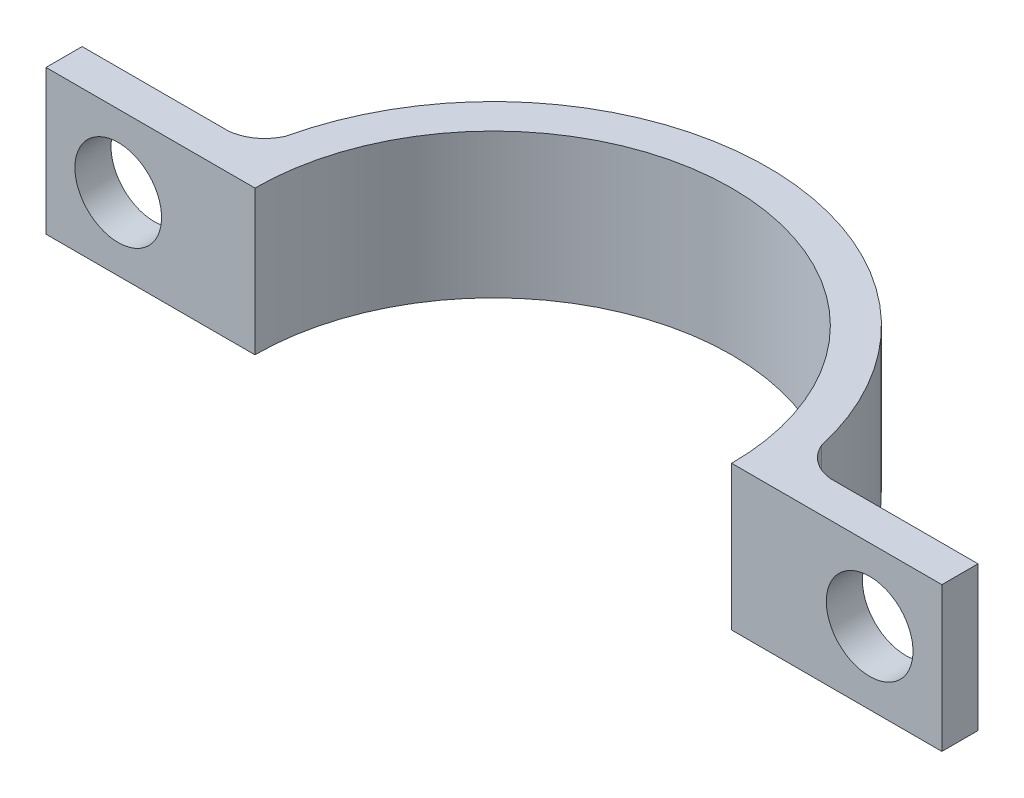
ISO-10303-21;
HEADER;
FILE_DESCRIPTION(('STEP AP214'),'2;1');
FILE_NAME('part.step','',(''),(''),'','','');
FILE_SCHEMA(('AUTOMOTIVE_DESIGN { 1 0 10303 214 1 1 1 1 }'));
ENDSEC;
DATA;
#1=APPLICATION_CONTEXT('core data for automotive mechanical design processes');
#2=APPLICATION_PROTOCOL_DEFINITION('international standard','automotive_design',2000,#1);
#3=PRODUCT_CONTEXT('',#1,'mechanical');
#4=PRODUCT('Part','Part','',(#3));
#5=PRODUCT_RELATED_PRODUCT_CATEGORY('part','',(#4));
#6=PRODUCT_DEFINITION_FORMATION('','',#4);
#7=PRODUCT_DEFINITION_CONTEXT('part definition',#1,'design');
#8=PRODUCT_DEFINITION('design','',#6,#7);
#9=PRODUCT_DEFINITION_SHAPE('','',#8);
#10=(LENGTH_UNIT() NAMED_UNIT(*) SI_UNIT(.MILLI.,.METRE.));
#11=(NAMED_UNIT(*) PLANE_ANGLE_UNIT() SI_UNIT($,.RADIAN.));
#12=(NAMED_UNIT(*) SI_UNIT($,.STERADIAN.) SOLID_ANGLE_UNIT());
#13=UNCERTAINTY_MEASURE_WITH_UNIT(LENGTH_MEASURE(1.E-05),#10,'distance_accuracy_value','');
#14=(GEOMETRIC_REPRESENTATION_CONTEXT(3) GLOBAL_UNCERTAINTY_ASSIGNED_CONTEXT((#13)) GLOBAL_UNIT_ASSIGNED_CONTEXT((#10,
#11,#12)) REPRESENTATION_CONTEXT('',''));
#15=CARTESIAN_POINT('',(0.,0.,0.));
#16=DIRECTION('',(0.,0.,1.));
#17=DIRECTION('',(1.,0.,0.));
#18=AXIS2_PLACEMENT_3D('',#15,#16,#17);
#19=CARTESIAN_POINT('',(22.902925638261,10.,4.77298113684332));
#20=DIRECTION('',(0.,-1.,0.));
#21=DIRECTION('',(0.,0.,-1.));
#22=AXIS2_PLACEMENT_3D('',#19,#20,#21);
#23=CYLINDRICAL_SURFACE('',#22,2.79217939644481);
#24=CARTESIAN_POINT('',(22.902925638261,0.,4.77298113684332));
#25=DIRECTION('',(0.,-1.,0.));
#26=DIRECTION('',(0.,0.,-1.));
#27=AXIS2_PLACEMENT_3D('',#24,#25,#26);
#28=CIRCLE('',#27,2.79217939644481);
#29=CARTESIAN_POINT('',(22.6391724501942,0.,7.5526753714158));
#30=VERTEX_POINT('',#29);
#31=CARTESIAN_POINT('',(20.3264501634081,0.,5.84910376434103));
#32=VERTEX_POINT('',#31);
#33=EDGE_CURVE('E144',#30,#32,#28,.T.);
#34=ORIENTED_EDGE('',*,*,#33,.T.);
#35=DIRECTION('',(0.,-1.,0.));
#36=VECTOR('',#35,1.);
#37=CARTESIAN_POINT('',(20.3264501634081,10.,5.84910376434103));
#38=LINE('',#37,#36);
#39=CARTESIAN_POINT('',(20.3264501634081,10.,5.84910376434103));
#40=VERTEX_POINT('',#39);
#41=EDGE_CURVE('E11',#40,#32,#38,.T.);
#42=ORIENTED_EDGE('',*,*,#41,.F.);
#43=CARTESIAN_POINT('',(22.902925638261,10.,4.77298113684332));
#44=DIRECTION('',(0.,-1.,0.));
#45=DIRECTION('',(0.,0.,-1.));
#46=AXIS2_PLACEMENT_3D('',#43,#44,#45);
#47=CIRCLE('',#46,2.79217939644481);
#48=CARTESIAN_POINT('',(22.6391724501942,10.,7.5526753714158));
#49=VERTEX_POINT('',#48);
#50=EDGE_CURVE('E162',#49,#40,#47,.T.);
#51=ORIENTED_EDGE('',*,*,#50,.F.);
#52=DIRECTION('',(0.,-1.,0.));
#53=VECTOR('',#52,1.);
#54=CARTESIAN_POINT('',(22.6391724501942,10.,7.5526753714158));
#55=LINE('',#54,#53);
#56=EDGE_CURVE('E140',#49,#30,#55,.T.);
#57=ORIENTED_EDGE('',*,*,#56,.T.);
#58=EDGE_LOOP('',(#34,#42,#51,#57));
#59=FACE_BOUND('',#58,.T.);
#60=ADVANCED_FACE('F35',(#59),#23,.F.);
#61=CARTESIAN_POINT('',(1.79728434990767,10.,10.0526753714158));
#62=DIRECTION('',(0.,-1.,0.));
#63=DIRECTION('',(0.,0.,-1.));
#64=AXIS2_PLACEMENT_3D('',#61,#62,#63);
#65=CYLINDRICAL_SURFACE('',#64,19.);
#66=CARTESIAN_POINT('',(1.79728434990767,0.,10.0526753714158));
#67=DIRECTION('',(0.,1.,0.));
#68=DIRECTION('',(0.,0.,1.));
#69=AXIS2_PLACEMENT_3D('',#66,#67,#68);
#70=CIRCLE('',#69,19.);
#71=CARTESIAN_POINT('',(-16.7318814635928,0.,5.849103764341));
#72=VERTEX_POINT('',#71);
#73=EDGE_CURVE('E147',#32,#72,#70,.T.);
#74=ORIENTED_EDGE('',*,*,#73,.T.);
#75=DIRECTION('',(0.,-1.,0.));
#76=VECTOR('',#75,1.);
#77=CARTESIAN_POINT('',(-16.7318814635928,10.,5.849103764341));
#78=LINE('',#77,#76);
#79=CARTESIAN_POINT('',(-16.7318814635928,10.,5.849103764341));
#80=VERTEX_POINT('',#79);
#81=EDGE_CURVE('E44',#80,#72,#78,.T.);
#82=ORIENTED_EDGE('',*,*,#81,.F.);
#83=CARTESIAN_POINT('',(1.79728434990767,10.,10.0526753714158));
#84=DIRECTION('',(0.,1.,0.));
#85=DIRECTION('',(0.,0.,1.));
#86=AXIS2_PLACEMENT_3D('',#83,#84,#85);
#87=CIRCLE('',#86,19.);
#88=EDGE_CURVE('E101',#40,#80,#87,.T.);
#89=ORIENTED_EDGE('',*,*,#88,.F.);
#90=ORIENTED_EDGE('',*,*,#41,.T.);
#91=EDGE_LOOP('',(#74,#82,#89,#90));
#92=FACE_BOUND('',#91,.T.);
#93=ADVANCED_FACE('F231',(#92),#65,.T.);
#94=CARTESIAN_POINT('',(-19.3083569384457,10.,4.77298113684332));
#95=DIRECTION('',(0.,-1.,0.));
#96=DIRECTION('',(0.,0.,-1.));
#97=AXIS2_PLACEMENT_3D('',#94,#95,#96);
#98=CYLINDRICAL_SURFACE('',#97,2.7921793964448);
#99=CARTESIAN_POINT('',(-19.3083569384457,0.,4.77298113684332));
#100=DIRECTION('',(0.,-1.,0.));
#101=DIRECTION('',(0.,0.,1.));
#102=AXIS2_PLACEMENT_3D('',#99,#100,#101);
#103=CIRCLE('',#102,2.7921793964448);
#104=CARTESIAN_POINT('',(-19.0446037503788,0.,7.55267537141579));
#105=VERTEX_POINT('',#104);
#106=EDGE_CURVE('E149',#72,#105,#103,.T.);
#107=ORIENTED_EDGE('',*,*,#106,.T.);
#108=DIRECTION('',(0.,-1.,0.));
#109=VECTOR('',#108,1.);
#110=CARTESIAN_POINT('',(-19.0446037503788,10.,7.55267537141579));
#111=LINE('',#110,#109);
#112=CARTESIAN_POINT('',(-19.0446037503788,10.,7.55267537141579));
#113=VERTEX_POINT('',#112);
#114=EDGE_CURVE('E175',#113,#105,#111,.T.);
#115=ORIENTED_EDGE('',*,*,#114,.F.);
#116=CARTESIAN_POINT('',(-19.3083569384457,10.,4.77298113684332));
#117=DIRECTION('',(0.,-1.,0.));
#118=DIRECTION('',(0.,0.,1.));
#119=AXIS2_PLACEMENT_3D('',#116,#117,#118);
#120=CIRCLE('',#119,2.7921793964448);
#121=EDGE_CURVE('E184',#80,#113,#120,.T.);
#122=ORIENTED_EDGE('',*,*,#121,.F.);
#123=ORIENTED_EDGE('',*,*,#81,.T.);
#124=EDGE_LOOP('',(#107,#115,#122,#123));
#125=FACE_BOUND('',#124,.T.);
#126=ADVANCED_FACE('F182',(#125),#98,.F.);
#127=CARTESIAN_POINT('',(-19.0446037503788,10.,7.5526753714158));
#128=DIRECTION('',(0.,0.,1.));
#129=DIRECTION('',(1.,0.,0.));
#130=AXIS2_PLACEMENT_3D('',#127,#128,#129);
#131=PLANE('',#130);
#132=CARTESIAN_POINT('',(-24.1654442066561,5.,7.5526753714158));
#133=DIRECTION('',(0.,0.,-1.));
#134=DIRECTION('',(-1.,0.,0.));
#135=AXIS2_PLACEMENT_3D('',#132,#133,#134);
#136=CIRCLE('',#135,3.);
#137=CARTESIAN_POINT('',(-27.1654442066561,5.,7.5526753714158));
#138=VERTEX_POINT('',#137);
#139=EDGE_CURVE('E213',#138,#138,#136,.T.);
#140=ORIENTED_EDGE('',*,*,#139,.F.);
#141=EDGE_LOOP('',(#140));
#142=FACE_BOUND('',#141,.T.);
#143=DIRECTION('',(-1.,0.,0.));
#144=VECTOR('',#143,1.);
#145=CARTESIAN_POINT('',(-19.0446037503788,0.,7.5526753714158));
#146=LINE('',#145,#144);
#147=CARTESIAN_POINT('',(-29.1654442066561,0.,7.5526753714158));
#148=VERTEX_POINT('',#147);
#149=EDGE_CURVE('E151',#105,#148,#146,.T.);
#150=ORIENTED_EDGE('',*,*,#149,.T.);
#151=DIRECTION('',(0.,-1.,0.));
#152=VECTOR('',#151,1.);
#153=CARTESIAN_POINT('',(-29.1654442066561,10.,7.5526753714158));
#154=LINE('',#153,#152);
#155=CARTESIAN_POINT('',(-29.1654442066561,10.,7.5526753714158));
#156=VERTEX_POINT('',#155);
#157=EDGE_CURVE('E172',#156,#148,#154,.T.);
#158=ORIENTED_EDGE('',*,*,#157,.F.);
#159=DIRECTION('',(-1.,0.,0.));
#160=VECTOR('',#159,1.);
#161=CARTESIAN_POINT('',(-19.0446037503788,10.,7.5526753714158));
#162=LINE('',#161,#160);
#163=EDGE_CURVE('E202',#113,#156,#162,.T.);
#164=ORIENTED_EDGE('',*,*,#163,.F.);
#165=ORIENTED_EDGE('',*,*,#114,.T.);
#166=EDGE_LOOP('',(#150,#158,#164,#165));
#167=FACE_BOUND('',#166,.T.);
#168=ADVANCED_FACE('F193',(#142,#167),#131,.F.);
#169=CARTESIAN_POINT('',(-29.1654442066561,10.,7.5526753714158));
#170=DIRECTION('',(1.,0.,0.));
#171=DIRECTION('',(0.,0.,-1.));
#172=AXIS2_PLACEMENT_3D('',#169,#170,#171);
#173=PLANE('',#172);
#174=DIRECTION('',(0.,0.,1.));
#175=VECTOR('',#174,1.);
#176=CARTESIAN_POINT('',(-29.1654442066561,0.,7.5526753714158));
#177=LINE('',#176,#175);
#178=CARTESIAN_POINT('',(-29.1654442066561,0.,10.0526753714158));
#179=VERTEX_POINT('',#178);
#180=EDGE_CURVE('E153',#148,#179,#177,.T.);
#181=ORIENTED_EDGE('',*,*,#180,.T.);
#182=DIRECTION('',(0.,-1.,0.));
#183=VECTOR('',#182,1.);
#184=CARTESIAN_POINT('',(-29.1654442066561,10.,10.0526753714158));
#185=LINE('',#184,#183);
#186=CARTESIAN_POINT('',(-29.1654442066561,10.,10.0526753714158));
#187=VERTEX_POINT('',#186);
#188=EDGE_CURVE('E169',#187,#179,#185,.T.);
#189=ORIENTED_EDGE('',*,*,#188,.F.);
#190=DIRECTION('',(0.,0.,1.));
#191=VECTOR('',#190,1.);
#192=CARTESIAN_POINT('',(-29.1654442066561,10.,7.5526753714158));
#193=LINE('',#192,#191);
#194=EDGE_CURVE('E199',#156,#187,#193,.T.);
#195=ORIENTED_EDGE('',*,*,#194,.F.);
#196=ORIENTED_EDGE('',*,*,#157,.T.);
#197=EDGE_LOOP('',(#181,#189,#195,#196));
#198=FACE_BOUND('',#197,.T.);
#199=ADVANCED_FACE('F197',(#198),#173,.F.);
#200=CARTESIAN_POINT('',(-14.7027156500923,10.,10.0526753714158));
#201=DIRECTION('',(0.,0.,-1.));
#202=DIRECTION('',(-1.,0.,0.));
#203=AXIS2_PLACEMENT_3D('',#200,#201,#202);
#204=PLANE('',#203);
#205=CARTESIAN_POINT('',(-24.1654442066561,5.,10.0526753714158));
#206=DIRECTION('',(0.,0.,-1.));
#207=DIRECTION('',(-1.,0.,0.));
#208=AXIS2_PLACEMENT_3D('',#205,#206,#207);
#209=CIRCLE('',#208,3.);
#210=CARTESIAN_POINT('',(-27.1654442066561,5.,10.0526753714158));
#211=VERTEX_POINT('',#210);
#212=EDGE_CURVE('E38',#211,#211,#209,.T.);
#213=ORIENTED_EDGE('',*,*,#212,.T.);
#214=EDGE_LOOP('',(#213));
#215=FACE_BOUND('',#214,.T.);
#216=DIRECTION('',(1.,0.,0.));
#217=VECTOR('',#216,1.);
#218=CARTESIAN_POINT('',(-14.7027156500923,0.,10.0526753714158));
#219=LINE('',#218,#217);
#220=CARTESIAN_POINT('',(-14.7027156500923,0.,10.0526753714158));
#221=VERTEX_POINT('',#220);
#222=EDGE_CURVE('E155',#179,#221,#219,.T.);
#223=ORIENTED_EDGE('',*,*,#222,.T.);
#224=DIRECTION('',(0.,-1.,0.));
#225=VECTOR('',#224,1.);
#226=CARTESIAN_POINT('',(-14.7027156500923,10.,10.0526753714158));
#227=LINE('',#226,#225);
#228=CARTESIAN_POINT('',(-14.7027156500923,10.,10.0526753714158));
#229=VERTEX_POINT('',#228);
#230=EDGE_CURVE('E166',#229,#221,#227,.T.);
#231=ORIENTED_EDGE('',*,*,#230,.F.);
#232=DIRECTION('',(1.,0.,0.));
#233=VECTOR('',#232,1.);
#234=CARTESIAN_POINT('',(-14.7027156500923,10.,10.0526753714158));
#235=LINE('',#234,#233);
#236=EDGE_CURVE('E201',#187,#229,#235,.T.);
#237=ORIENTED_EDGE('',*,*,#236,.F.);
#238=ORIENTED_EDGE('',*,*,#188,.T.);
#239=EDGE_LOOP('',(#223,#231,#237,#238));
#240=FACE_BOUND('',#239,.T.);
#241=ADVANCED_FACE('F229',(#215,#240),#204,.F.);
#242=CARTESIAN_POINT('',(1.79728434990767,10.,10.0526753714158));
#243=DIRECTION('',(0.,-1.,0.));
#244=DIRECTION('',(0.,0.,-1.));
#245=AXIS2_PLACEMENT_3D('',#242,#243,#244);
#246=CYLINDRICAL_SURFACE('',#245,16.5);
#247=CARTESIAN_POINT('',(1.79728434990767,0.,10.0526753714158));
#248=DIRECTION('',(0.,-1.,0.));
#249=DIRECTION('',(0.,0.,1.));
#250=AXIS2_PLACEMENT_3D('',#247,#248,#249);
#251=CIRCLE('',#250,16.5);
#252=CARTESIAN_POINT('',(18.2972843499077,0.,10.0526753714158));
#253=VERTEX_POINT('',#252);
#254=EDGE_CURVE('E157',#221,#253,#251,.T.);
#255=ORIENTED_EDGE('',*,*,#254,.T.);
#256=DIRECTION('',(0.,-1.,0.));
#257=VECTOR('',#256,1.);
#258=CARTESIAN_POINT('',(18.2972843499077,10.,10.0526753714158));
#259=LINE('',#258,#257);
#260=CARTESIAN_POINT('',(18.2972843499077,10.,10.0526753714158));
#261=VERTEX_POINT('',#260);
#262=EDGE_CURVE('E135',#261,#253,#259,.T.);
#263=ORIENTED_EDGE('',*,*,#262,.F.);
#264=CARTESIAN_POINT('',(1.79728434990767,10.,10.0526753714158));
#265=DIRECTION('',(0.,-1.,0.));
#266=DIRECTION('',(0.,0.,1.));
#267=AXIS2_PLACEMENT_3D('',#264,#265,#266);
#268=CIRCLE('',#267,16.5);
#269=EDGE_CURVE('E126',#229,#261,#268,.T.);
#270=ORIENTED_EDGE('',*,*,#269,.F.);
#271=ORIENTED_EDGE('',*,*,#230,.T.);
#272=EDGE_LOOP('',(#255,#263,#270,#271));
#273=FACE_BOUND('',#272,.T.);
#274=ADVANCED_FACE('F242',(#273),#246,.F.);
#275=CARTESIAN_POINT('',(18.2972843499077,10.,10.0526753714158));
#276=DIRECTION('',(0.,0.,-1.));
#277=DIRECTION('',(-1.,0.,0.));
#278=AXIS2_PLACEMENT_3D('',#275,#276,#277);
#279=PLANE('',#278);
#280=CARTESIAN_POINT('',(27.8499466827615,5.,10.0526753714158));
#281=DIRECTION('',(0.,0.,-1.));
#282=DIRECTION('',(-1.,0.,0.));
#283=AXIS2_PLACEMENT_3D('',#280,#281,#282);
#284=CIRCLE('',#283,3.);
#285=CARTESIAN_POINT('',(24.8499466827615,5.,10.0526753714158));
#286=VERTEX_POINT('',#285);
#287=EDGE_CURVE('E210',#286,#286,#284,.T.);
#288=ORIENTED_EDGE('',*,*,#287,.T.);
#289=EDGE_LOOP('',(#288));
#290=FACE_BOUND('',#289,.T.);
#291=DIRECTION('',(1.,0.,0.));
#292=VECTOR('',#291,1.);
#293=CARTESIAN_POINT('',(18.2972843499077,0.,10.0526753714158));
#294=LINE('',#293,#292);
#295=CARTESIAN_POINT('',(32.8499466827615,0.,10.0526753714158));
#296=VERTEX_POINT('',#295);
#297=EDGE_CURVE('E134',#253,#296,#294,.T.);
#298=ORIENTED_EDGE('',*,*,#297,.T.);
#299=DIRECTION('',(0.,-1.,0.));
#300=VECTOR('',#299,1.);
#301=CARTESIAN_POINT('',(32.8499466827615,10.,10.0526753714158));
#302=LINE('',#301,#300);
#303=CARTESIAN_POINT('',(32.8499466827615,10.,10.0526753714158));
#304=VERTEX_POINT('',#303);
#305=EDGE_CURVE('E131',#304,#296,#302,.T.);
#306=ORIENTED_EDGE('',*,*,#305,.F.);
#307=DIRECTION('',(1.,0.,0.));
#308=VECTOR('',#307,1.);
#309=CARTESIAN_POINT('',(18.2972843499077,10.,10.0526753714158));
#310=LINE('',#309,#308);
#311=EDGE_CURVE('E120',#261,#304,#310,.T.);
#312=ORIENTED_EDGE('',*,*,#311,.F.);
#313=ORIENTED_EDGE('',*,*,#262,.T.);
#314=EDGE_LOOP('',(#298,#306,#312,#313));
#315=FACE_BOUND('',#314,.T.);
#316=ADVANCED_FACE('F132',(#290,#315),#279,.F.);
#317=CARTESIAN_POINT('',(32.8499466827615,10.,7.5526753714158));
#318=DIRECTION('',(-1.,0.,0.));
#319=DIRECTION('',(0.,0.,1.));
#320=AXIS2_PLACEMENT_3D('',#317,#318,#319);
#321=PLANE('',#320);
#322=DIRECTION('',(0.,0.,-1.));
#323=VECTOR('',#322,1.);
#324=CARTESIAN_POINT('',(32.8499466827615,0.,7.5526753714158));
#325=LINE('',#324,#323);
#326=CARTESIAN_POINT('',(32.8499466827615,0.,7.5526753714158));
#327=VERTEX_POINT('',#326);
#328=EDGE_CURVE('E87',#296,#327,#325,.T.);
#329=ORIENTED_EDGE('',*,*,#328,.T.);
#330=DIRECTION('',(0.,-1.,0.));
#331=VECTOR('',#330,1.);
#332=CARTESIAN_POINT('',(32.8499466827615,10.,7.5526753714158));
#333=LINE('',#332,#331);
#334=CARTESIAN_POINT('',(32.8499466827615,10.,7.5526753714158));
#335=VERTEX_POINT('',#334);
#336=EDGE_CURVE('E136',#335,#327,#333,.T.);
#337=ORIENTED_EDGE('',*,*,#336,.F.);
#338=DIRECTION('',(0.,0.,-1.));
#339=VECTOR('',#338,1.);
#340=CARTESIAN_POINT('',(32.8499466827615,10.,7.5526753714158));
#341=LINE('',#340,#339);
#342=EDGE_CURVE('E124',#304,#335,#341,.T.);
#343=ORIENTED_EDGE('',*,*,#342,.F.);
#344=ORIENTED_EDGE('',*,*,#305,.T.);
#345=EDGE_LOOP('',(#329,#337,#343,#344));
#346=FACE_BOUND('',#345,.T.);
#347=ADVANCED_FACE('F138',(#346),#321,.F.);
#348=CARTESIAN_POINT('',(22.6391724501942,10.,7.5526753714158));
#349=DIRECTION('',(0.,0.,1.));
#350=DIRECTION('',(1.,0.,0.));
#351=AXIS2_PLACEMENT_3D('',#348,#349,#350);
#352=PLANE('',#351);
#353=CARTESIAN_POINT('',(27.8499466827615,5.,7.5526753714158));
#354=DIRECTION('',(0.,0.,-1.));
#355=DIRECTION('',(-1.,0.,0.));
#356=AXIS2_PLACEMENT_3D('',#353,#354,#355);
#357=CIRCLE('',#356,3.);
#358=CARTESIAN_POINT('',(24.8499466827615,5.,7.5526753714158));
#359=VERTEX_POINT('',#358);
#360=EDGE_CURVE('E214',#359,#359,#357,.T.);
#361=ORIENTED_EDGE('',*,*,#360,.F.);
#362=EDGE_LOOP('',(#361));
#363=FACE_BOUND('',#362,.T.);
#364=DIRECTION('',(-1.,0.,0.));
#365=VECTOR('',#364,1.);
#366=CARTESIAN_POINT('',(22.6391724501942,0.,7.5526753714158));
#367=LINE('',#366,#365);
#368=EDGE_CURVE('E93',#327,#30,#367,.T.);
#369=ORIENTED_EDGE('',*,*,#368,.T.);
#370=ORIENTED_EDGE('',*,*,#56,.F.);
#371=DIRECTION('',(-1.,0.,0.));
#372=VECTOR('',#371,1.);
#373=CARTESIAN_POINT('',(22.6391724501942,10.,7.5526753714158));
#374=LINE('',#373,#372);
#375=EDGE_CURVE('E52',#335,#49,#374,.T.);
#376=ORIENTED_EDGE('',*,*,#375,.F.);
#377=ORIENTED_EDGE('',*,*,#336,.T.);
#378=EDGE_LOOP('',(#369,#370,#376,#377));
#379=FACE_BOUND('',#378,.T.);
#380=ADVANCED_FACE('F259',(#363,#379),#352,.F.);
#381=CARTESIAN_POINT('',(22.902925638261,10.,4.77298113684332));
#382=DIRECTION('',(0.,-1.,0.));
#383=DIRECTION('',(0.,0.,-1.));
#384=AXIS2_PLACEMENT_3D('',#381,#382,#383);
#385=PLANE('',#384);
#386=ORIENTED_EDGE('',*,*,#50,.T.);
#387=ORIENTED_EDGE('',*,*,#88,.T.);
#388=ORIENTED_EDGE('',*,*,#121,.T.);
#389=ORIENTED_EDGE('',*,*,#163,.T.);
#390=ORIENTED_EDGE('',*,*,#194,.T.);
#391=ORIENTED_EDGE('',*,*,#236,.T.);
#392=ORIENTED_EDGE('',*,*,#269,.T.);
#393=ORIENTED_EDGE('',*,*,#311,.T.);
#394=ORIENTED_EDGE('',*,*,#342,.T.);
#395=ORIENTED_EDGE('',*,*,#375,.T.);
#396=EDGE_LOOP('',(#386,#387,#388,#389,#390,#391,#392,#393,#394,#395));
#397=FACE_BOUND('',#396,.T.);
#398=ADVANCED_FACE('F122',(#397),#385,.F.);
#399=CARTESIAN_POINT('',(22.902925638261,0.,4.77298113684332));
#400=DIRECTION('',(0.,-1.,0.));
#401=DIRECTION('',(0.,0.,-1.));
#402=AXIS2_PLACEMENT_3D('',#399,#400,#401);
#403=PLANE('',#402);
#404=ORIENTED_EDGE('',*,*,#33,.F.);
#405=ORIENTED_EDGE('',*,*,#368,.F.);
#406=ORIENTED_EDGE('',*,*,#328,.F.);
#407=ORIENTED_EDGE('',*,*,#297,.F.);
#408=ORIENTED_EDGE('',*,*,#254,.F.);
#409=ORIENTED_EDGE('',*,*,#222,.F.);
#410=ORIENTED_EDGE('',*,*,#180,.F.);
#411=ORIENTED_EDGE('',*,*,#149,.F.);
#412=ORIENTED_EDGE('',*,*,#106,.F.);
#413=ORIENTED_EDGE('',*,*,#73,.F.);
#414=EDGE_LOOP('',(#404,#405,#406,#407,#408,#409,#410,#411,#412,#413));
#415=FACE_BOUND('',#414,.T.);
#416=ADVANCED_FACE('F188',(#415),#403,.T.);
#417=CARTESIAN_POINT('',(27.8499466827615,5.,15.5526753714158));
#418=DIRECTION('',(0.,0.,-1.));
#419=DIRECTION('',(-1.,0.,0.));
#420=AXIS2_PLACEMENT_3D('',#417,#418,#419);
#421=CYLINDRICAL_SURFACE('',#420,3.);
#422=ORIENTED_EDGE('',*,*,#360,.T.);
#423=EDGE_LOOP('',(#422));
#424=FACE_BOUND('',#423,.T.);
#425=ORIENTED_EDGE('',*,*,#287,.F.);
#426=EDGE_LOOP('',(#425));
#427=FACE_BOUND('',#426,.T.);
#428=ADVANCED_FACE('F265',(#424,#427),#421,.F.);
#429=CARTESIAN_POINT('',(-24.1654442066561,5.,15.5526753714158));
#430=DIRECTION('',(0.,0.,-1.));
#431=DIRECTION('',(-1.,0.,0.));
#432=AXIS2_PLACEMENT_3D('',#429,#430,#431);
#433=CYLINDRICAL_SURFACE('',#432,3.);
#434=ORIENTED_EDGE('',*,*,#139,.T.);
#435=EDGE_LOOP('',(#434));
#436=FACE_BOUND('',#435,.T.);
#437=ORIENTED_EDGE('',*,*,#212,.F.);
#438=EDGE_LOOP('',(#437));
#439=FACE_BOUND('',#438,.T.);
#440=ADVANCED_FACE('F220',(#436,#439),#433,.F.);
#441=CLOSED_SHELL('',(#60,#93,#126,#168,#199,#241,#274,#316,#347,#380,#398,#416,#428,#440));
#442=MANIFOLD_SOLID_BREP('B2',#441);
#443=ADVANCED_BREP_SHAPE_REPRESENTATION('',(#18,#442),#14);
#444=SHAPE_DEFINITION_REPRESENTATION(#9,#443);
ENDSEC;
END-ISO-10303-21;
